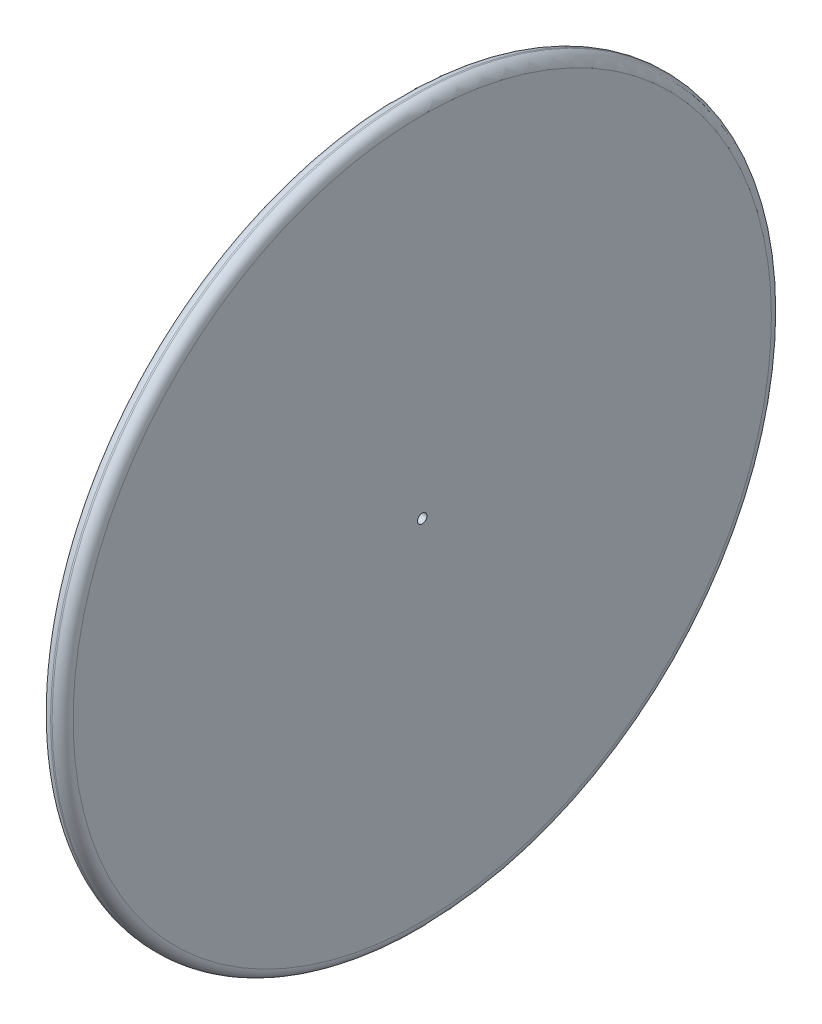
ISO-10303-21;
HEADER;
FILE_DESCRIPTION(('STEP AP214'),'2;1');
FILE_NAME('part.step','',(''),(''),'','','');
FILE_SCHEMA(('AUTOMOTIVE_DESIGN { 1 0 10303 214 1 1 1 1 }'));
ENDSEC;
DATA;
#1=APPLICATION_CONTEXT('core data for automotive mechanical design processes');
#2=APPLICATION_PROTOCOL_DEFINITION('international standard','automotive_design',2000,#1);
#3=PRODUCT_CONTEXT('',#1,'mechanical');
#4=PRODUCT('Part','Part','',(#3));
#5=PRODUCT_RELATED_PRODUCT_CATEGORY('part','',(#4));
#6=PRODUCT_DEFINITION_FORMATION('','',#4);
#7=PRODUCT_DEFINITION_CONTEXT('part definition',#1,'design');
#8=PRODUCT_DEFINITION('design','',#6,#7);
#9=PRODUCT_DEFINITION_SHAPE('','',#8);
#10=(LENGTH_UNIT() NAMED_UNIT(*) SI_UNIT(.MILLI.,.METRE.));
#11=(NAMED_UNIT(*) PLANE_ANGLE_UNIT() SI_UNIT($,.RADIAN.));
#12=(NAMED_UNIT(*) SI_UNIT($,.STERADIAN.) SOLID_ANGLE_UNIT());
#13=UNCERTAINTY_MEASURE_WITH_UNIT(LENGTH_MEASURE(1.E-05),#10,'distance_accuracy_value','');
#14=(GEOMETRIC_REPRESENTATION_CONTEXT(3) GLOBAL_UNCERTAINTY_ASSIGNED_CONTEXT((#13)) GLOBAL_UNIT_ASSIGNED_CONTEXT((#10,
#11,#12)) REPRESENTATION_CONTEXT('',''));
#15=CARTESIAN_POINT('',(0.,0.,0.));
#16=DIRECTION('',(0.,0.,1.));
#17=DIRECTION('',(1.,0.,0.));
#18=AXIS2_PLACEMENT_3D('',#15,#16,#17);
#19=CARTESIAN_POINT('',(19.05,0.,0.));
#20=DIRECTION('',(1.,0.,0.));
#21=DIRECTION('',(0.,0.,-1.));
#22=AXIS2_PLACEMENT_3D('',#19,#20,#21);
#23=PLANE('',#22);
#24=CARTESIAN_POINT('',(19.05,0.,0.));
#25=DIRECTION('',(1.,0.,0.));
#26=DIRECTION('',(0.,0.,-1.));
#27=AXIS2_PLACEMENT_3D('',#24,#25,#26);
#28=CIRCLE('',#27,295.91);
#29=CARTESIAN_POINT('',(19.05,0.,-295.91));
#30=VERTEX_POINT('',#29);
#31=EDGE_CURVE('E10',#30,#30,#28,.T.);
#32=ORIENTED_EDGE('',*,*,#31,.T.);
#33=EDGE_LOOP('',(#32));
#34=FACE_BOUND('',#33,.T.);
#35=CARTESIAN_POINT('',(19.05,0.,0.));
#36=DIRECTION('',(1.,0.,0.));
#37=DIRECTION('',(0.,0.,-1.));
#38=AXIS2_PLACEMENT_3D('',#35,#36,#37);
#39=CIRCLE('',#38,3.9878);
#40=CARTESIAN_POINT('',(19.05,0.,3.9878));
#41=VERTEX_POINT('',#40);
#42=EDGE_CURVE('E52',#41,#41,#39,.T.);
#43=ORIENTED_EDGE('',*,*,#42,.F.);
#44=EDGE_LOOP('',(#43));
#45=FACE_BOUND('',#44,.T.);
#46=ADVANCED_FACE('F32',(#34,#45),#23,.T.);
#47=CARTESIAN_POINT('',(0.,0.,0.));
#48=DIRECTION('',(1.,0.,0.));
#49=DIRECTION('',(0.,0.,-1.));
#50=AXIS2_PLACEMENT_3D('',#47,#48,#49);
#51=PLANE('',#50);
#52=CARTESIAN_POINT('',(0.,0.,0.));
#53=DIRECTION('',(1.,0.,0.));
#54=DIRECTION('',(0.,0.,-1.));
#55=AXIS2_PLACEMENT_3D('',#52,#53,#54);
#56=CIRCLE('',#55,295.91);
#57=CARTESIAN_POINT('',(0.,0.,-295.91));
#58=VERTEX_POINT('',#57);
#59=EDGE_CURVE('E39',#58,#58,#56,.F.);
#60=ORIENTED_EDGE('',*,*,#59,.T.);
#61=EDGE_LOOP('',(#60));
#62=FACE_BOUND('',#61,.T.);
#63=CARTESIAN_POINT('',(0.,0.,0.));
#64=DIRECTION('',(1.,0.,0.));
#65=DIRECTION('',(0.,0.,-1.));
#66=AXIS2_PLACEMENT_3D('',#63,#64,#65);
#67=CIRCLE('',#66,3.9878);
#68=CARTESIAN_POINT('',(0.,0.,3.9878));
#69=VERTEX_POINT('',#68);
#70=EDGE_CURVE('E53',#69,#69,#67,.T.);
#71=ORIENTED_EDGE('',*,*,#70,.T.);
#72=EDGE_LOOP('',(#71));
#73=FACE_BOUND('',#72,.T.);
#74=ADVANCED_FACE('F63',(#62,#73),#51,.F.);
#75=CARTESIAN_POINT('',(19.05,0.,0.));
#76=DIRECTION('',(-1.,0.,0.));
#77=DIRECTION('',(0.,0.,1.));
#78=AXIS2_PLACEMENT_3D('',#75,#76,#77);
#79=CYLINDRICAL_SURFACE('',#78,304.8);
#80=CARTESIAN_POINT('',(8.89,0.,0.));
#81=DIRECTION('',(1.,0.,0.));
#82=DIRECTION('',(0.,0.,-1.));
#83=AXIS2_PLACEMENT_3D('',#80,#81,#82);
#84=CIRCLE('',#83,304.8);
#85=CARTESIAN_POINT('',(8.89,0.,304.8));
#86=VERTEX_POINT('',#85);
#87=EDGE_CURVE('E43',#86,#86,#84,.T.);
#88=CARTESIAN_POINT('',(10.16,0.,0.));
#89=DIRECTION('',(1.,0.,0.));
#90=DIRECTION('',(0.,0.,-1.));
#91=AXIS2_PLACEMENT_3D('',#88,#89,#90);
#92=CIRCLE('',#91,304.8);
#93=CARTESIAN_POINT('',(10.16,0.,304.8));
#94=VERTEX_POINT('',#93);
#95=EDGE_CURVE('E47',#94,#94,#92,.F.);
#96=CARTESIAN_POINT('',(8.89,0.,304.8));
#97=CARTESIAN_POINT('',(8.90322916666666,0.,304.8));
#98=CARTESIAN_POINT('',(8.91645833333333,0.,304.8));
#99=CARTESIAN_POINT('',(8.94291666666666,0.,304.8));
#100=CARTESIAN_POINT('',(8.95614583333333,0.,304.8));
#101=CARTESIAN_POINT('',(8.98260416666666,0.,304.8));
#102=CARTESIAN_POINT('',(8.99583333333333,0.,304.8));
#103=CARTESIAN_POINT('',(9.02229166666666,0.,304.8));
#104=CARTESIAN_POINT('',(9.03552083333333,0.,304.8));
#105=CARTESIAN_POINT('',(9.06197916666666,0.,304.8));
#106=CARTESIAN_POINT('',(9.07520833333333,0.,304.8));
#107=CARTESIAN_POINT('',(9.10166666666666,0.,304.8));
#108=CARTESIAN_POINT('',(9.11489583333333,0.,304.8));
#109=CARTESIAN_POINT('',(9.14135416666666,0.,304.8));
#110=CARTESIAN_POINT('',(9.15458333333333,0.,304.8));
#111=CARTESIAN_POINT('',(9.18104166666666,0.,304.8));
#112=CARTESIAN_POINT('',(9.19427083333333,0.,304.8));
#113=CARTESIAN_POINT('',(9.22072916666666,0.,304.8));
#114=CARTESIAN_POINT('',(9.23395833333333,0.,304.8));
#115=CARTESIAN_POINT('',(9.26041666666666,0.,304.8));
#116=CARTESIAN_POINT('',(9.27364583333333,0.,304.8));
#117=CARTESIAN_POINT('',(9.30010416666667,0.,304.8));
#118=CARTESIAN_POINT('',(9.31333333333333,0.,304.8));
#119=CARTESIAN_POINT('',(9.33979166666666,0.,304.8));
#120=CARTESIAN_POINT('',(9.35302083333333,0.,304.8));
#121=CARTESIAN_POINT('',(9.37947916666666,0.,304.8));
#122=CARTESIAN_POINT('',(9.39270833333333,0.,304.8));
#123=CARTESIAN_POINT('',(9.41916666666666,0.,304.8));
#124=CARTESIAN_POINT('',(9.43239583333333,0.,304.8));
#125=CARTESIAN_POINT('',(9.45885416666667,0.,304.8));
#126=CARTESIAN_POINT('',(9.47208333333333,0.,304.8));
#127=CARTESIAN_POINT('',(9.49854166666667,0.,304.8));
#128=CARTESIAN_POINT('',(9.51177083333333,0.,304.8));
#129=CARTESIAN_POINT('',(9.53822916666667,0.,304.8));
#130=CARTESIAN_POINT('',(9.55145833333333,0.,304.8));
#131=CARTESIAN_POINT('',(9.57791666666667,0.,304.8));
#132=CARTESIAN_POINT('',(9.59114583333333,0.,304.8));
#133=CARTESIAN_POINT('',(9.61760416666666,0.,304.8));
#134=CARTESIAN_POINT('',(9.63083333333333,0.,304.8));
#135=CARTESIAN_POINT('',(9.65729166666667,0.,304.8));
#136=CARTESIAN_POINT('',(9.67052083333333,0.,304.8));
#137=CARTESIAN_POINT('',(9.69697916666667,0.,304.8));
#138=CARTESIAN_POINT('',(9.71020833333333,0.,304.8));
#139=CARTESIAN_POINT('',(9.73666666666667,0.,304.8));
#140=CARTESIAN_POINT('',(9.74989583333333,0.,304.8));
#141=CARTESIAN_POINT('',(9.77635416666667,0.,304.8));
#142=CARTESIAN_POINT('',(9.78958333333333,0.,304.8));
#143=CARTESIAN_POINT('',(9.81604166666667,0.,304.8));
#144=CARTESIAN_POINT('',(9.82927083333333,0.,304.8));
#145=CARTESIAN_POINT('',(9.85572916666666,0.,304.8));
#146=CARTESIAN_POINT('',(9.86895833333333,0.,304.8));
#147=CARTESIAN_POINT('',(9.89541666666667,0.,304.8));
#148=CARTESIAN_POINT('',(9.90864583333333,0.,304.8));
#149=CARTESIAN_POINT('',(9.93510416666667,0.,304.8));
#150=CARTESIAN_POINT('',(9.94833333333333,0.,304.8));
#151=CARTESIAN_POINT('',(9.97479166666667,0.,304.8));
#152=CARTESIAN_POINT('',(9.98802083333333,0.,304.8));
#153=CARTESIAN_POINT('',(10.0144791666667,0.,304.8));
#154=CARTESIAN_POINT('',(10.0277083333333,0.,304.8));
#155=CARTESIAN_POINT('',(10.0541666666667,0.,304.8));
#156=CARTESIAN_POINT('',(10.0673958333333,0.,304.8));
#157=CARTESIAN_POINT('',(10.0938541666667,0.,304.8));
#158=CARTESIAN_POINT('',(10.1070833333333,0.,304.8));
#159=CARTESIAN_POINT('',(10.1335416666667,0.,304.8));
#160=CARTESIAN_POINT('',(10.1467708333333,0.,304.8));
#161=CARTESIAN_POINT('',(10.16,0.,304.8));
#162=B_SPLINE_CURVE_WITH_KNOTS('',3,(#96,#97,#98,#99,#100,#101,#102,#103,#104,#105,#106,#107,
#108,#109,#110,#111,#112,#113,#114,#115,#116,#117,#118,#119,#120,#121,#122,#123,#124,#125,#126,
#127,#128,#129,#130,#131,#132,#133,#134,#135,#136,#137,#138,#139,#140,#141,#142,#143,#144,#145,
#146,#147,#148,#149,#150,#151,#152,#153,#154,#155,#156,#157,#158,#159,#160,#161),.UNSPECIFIED.,
.F.,.F.,(4,2,2,2,2,2,2,2,2,2,2,2,2,2,2,2,2,2,2,2,2,2,2,2,2,2,2,2,2,2,2,2,4),(0.,
0.0396874999999998,0.0793749999999996,0.119062500000001,0.158750000000001,0.198437500000001,
0.238125,0.2778125,0.317500000000002,0.357187500000002,0.396875000000001,0.436562500000001,
0.476250000000001,0.515937500000001,0.555625000000002,0.595312500000002,0.635000000000002,
0.674687500000002,0.714375000000001,0.754062500000003,0.793750000000003,0.833437500000003,
0.873125000000002,0.912812500000002,0.952500000000002,0.992187500000003,1.031875,1.0715625,
1.11125,1.1509375,1.190625,1.2303125,1.27),.UNSPECIFIED.);
#163=EDGE_CURVE('BSEAM68',#86,#94,#162,.T.);
#164=ORIENTED_EDGE('',*,*,#87,.T.);
#165=ORIENTED_EDGE('',*,*,#95,.T.);
#166=ORIENTED_EDGE('',*,*,#163,.T.);
#167=ORIENTED_EDGE('',*,*,#163,.F.);
#168=EDGE_LOOP('',(#164,#166,#165,#167));
#169=FACE_BOUND('',#168,.T.);
#170=ADVANCED_FACE('F68',(#169),#79,.T.);
#171=CARTESIAN_POINT('',(19.05,0.,0.));
#172=DIRECTION('',(-1.,0.,0.));
#173=DIRECTION('',(0.,0.,1.));
#174=AXIS2_PLACEMENT_3D('',#171,#172,#173);
#175=CYLINDRICAL_SURFACE('',#174,3.9878);
#176=CARTESIAN_POINT('',(19.05,0.,3.9878));
#177=CARTESIAN_POINT('',(18.8515625,0.,3.9878));
#178=CARTESIAN_POINT('',(18.653125,0.,3.9878));
#179=CARTESIAN_POINT('',(18.25625,0.,3.9878));
#180=CARTESIAN_POINT('',(18.0578125,0.,3.9878));
#181=CARTESIAN_POINT('',(17.6609375,0.,3.9878));
#182=CARTESIAN_POINT('',(17.4625,0.,3.9878));
#183=CARTESIAN_POINT('',(17.065625,0.,3.9878));
#184=CARTESIAN_POINT('',(16.8671875,0.,3.9878));
#185=CARTESIAN_POINT('',(16.4703125,0.,3.9878));
#186=CARTESIAN_POINT('',(16.271875,0.,3.9878));
#187=CARTESIAN_POINT('',(15.875,0.,3.9878));
#188=CARTESIAN_POINT('',(15.6765625,0.,3.9878));
#189=CARTESIAN_POINT('',(15.2796875,0.,3.9878));
#190=CARTESIAN_POINT('',(15.08125,0.,3.9878));
#191=CARTESIAN_POINT('',(14.684375,0.,3.9878));
#192=CARTESIAN_POINT('',(14.4859375,0.,3.9878));
#193=CARTESIAN_POINT('',(14.0890625,0.,3.9878));
#194=CARTESIAN_POINT('',(13.890625,0.,3.9878));
#195=CARTESIAN_POINT('',(13.49375,0.,3.9878));
#196=CARTESIAN_POINT('',(13.2953125,0.,3.9878));
#197=CARTESIAN_POINT('',(12.8984375,0.,3.9878));
#198=CARTESIAN_POINT('',(12.7,0.,3.9878));
#199=CARTESIAN_POINT('',(12.303125,0.,3.9878));
#200=CARTESIAN_POINT('',(12.1046875,0.,3.9878));
#201=CARTESIAN_POINT('',(11.7078125,0.,3.9878));
#202=CARTESIAN_POINT('',(11.509375,0.,3.9878));
#203=CARTESIAN_POINT('',(11.1125,0.,3.9878));
#204=CARTESIAN_POINT('',(10.9140625,0.,3.9878));
#205=CARTESIAN_POINT('',(10.5171875,0.,3.9878));
#206=CARTESIAN_POINT('',(10.31875,0.,3.9878));
#207=CARTESIAN_POINT('',(9.921875,0.,3.9878));
#208=CARTESIAN_POINT('',(9.7234375,0.,3.9878));
#209=CARTESIAN_POINT('',(9.3265625,0.,3.9878));
#210=CARTESIAN_POINT('',(9.128125,0.,3.9878));
#211=CARTESIAN_POINT('',(8.73125,0.,3.9878));
#212=CARTESIAN_POINT('',(8.5328125,0.,3.9878));
#213=CARTESIAN_POINT('',(8.1359375,0.,3.9878));
#214=CARTESIAN_POINT('',(7.9375,0.,3.9878));
#215=CARTESIAN_POINT('',(7.540625,0.,3.9878));
#216=CARTESIAN_POINT('',(7.3421875,0.,3.9878));
#217=CARTESIAN_POINT('',(6.9453125,0.,3.9878));
#218=CARTESIAN_POINT('',(6.746875,0.,3.9878));
#219=CARTESIAN_POINT('',(6.35,0.,3.9878));
#220=CARTESIAN_POINT('',(6.1515625,0.,3.9878));
#221=CARTESIAN_POINT('',(5.7546875,0.,3.9878));
#222=CARTESIAN_POINT('',(5.55625,0.,3.9878));
#223=CARTESIAN_POINT('',(5.159375,0.,3.9878));
#224=CARTESIAN_POINT('',(4.9609375,0.,3.9878));
#225=CARTESIAN_POINT('',(4.5640625,0.,3.9878));
#226=CARTESIAN_POINT('',(4.365625,0.,3.9878));
#227=CARTESIAN_POINT('',(3.96875,0.,3.9878));
#228=CARTESIAN_POINT('',(3.7703125,0.,3.9878));
#229=CARTESIAN_POINT('',(3.3734375,0.,3.9878));
#230=CARTESIAN_POINT('',(3.175,0.,3.9878));
#231=CARTESIAN_POINT('',(2.778125,0.,3.9878));
#232=CARTESIAN_POINT('',(2.5796875,0.,3.9878));
#233=CARTESIAN_POINT('',(2.1828125,0.,3.9878));
#234=CARTESIAN_POINT('',(1.984375,0.,3.9878));
#235=CARTESIAN_POINT('',(1.5875,0.,3.9878));
#236=CARTESIAN_POINT('',(1.3890625,0.,3.9878));
#237=CARTESIAN_POINT('',(0.992187500000001,0.,3.9878));
#238=CARTESIAN_POINT('',(0.793750000000001,0.,3.9878));
#239=CARTESIAN_POINT('',(0.396875,0.,3.9878));
#240=CARTESIAN_POINT('',(0.1984375,0.,3.9878));
#241=CARTESIAN_POINT('',(0.,0.,3.9878));
#242=B_SPLINE_CURVE_WITH_KNOTS('',3,(#176,#177,#178,#179,#180,#181,#182,#183,#184,#185,#186,
#187,#188,#189,#190,#191,#192,#193,#194,#195,#196,#197,#198,#199,#200,#201,#202,#203,#204,#205,
#206,#207,#208,#209,#210,#211,#212,#213,#214,#215,#216,#217,#218,#219,#220,#221,#222,#223,#224,
#225,#226,#227,#228,#229,#230,#231,#232,#233,#234,#235,#236,#237,#238,#239,#240,#241),
.UNSPECIFIED.,.F.,.F.,(4,2,2,2,2,2,2,2,2,2,2,2,2,2,2,2,2,2,2,2,2,2,2,2,2,2,2,2,2,2,2,2,4),(0.,
0.5953125,1.190625,1.7859375,2.38125,2.9765625,3.571875,4.1671875,4.7625,5.3578125,5.953125,
6.5484375,7.14375,7.7390625,8.334375,8.9296875,9.525,10.1203125,10.715625,11.3109375,11.90625,
12.5015625,13.096875,13.6921875,14.2875,14.8828125,15.478125,16.0734375,16.66875,17.2640625,
17.859375,18.4546875,19.05),.UNSPECIFIED.);
#243=EDGE_CURVE('BSEAM59',#41,#69,#242,.T.);
#244=ORIENTED_EDGE('',*,*,#42,.T.);
#245=ORIENTED_EDGE('',*,*,#70,.F.);
#246=ORIENTED_EDGE('',*,*,#243,.T.);
#247=ORIENTED_EDGE('',*,*,#243,.F.);
#248=EDGE_LOOP('',(#244,#246,#245,#247));
#249=FACE_BOUND('',#248,.T.);
#250=ADVANCED_FACE('F59',(#249),#175,.F.);
#251=CARTESIAN_POINT('',(8.89,0.,0.));
#252=DIRECTION('',(1.,0.,0.));
#253=DIRECTION('',(0.,0.,-1.));
#254=AXIS2_PLACEMENT_3D('',#251,#252,#253);
#255=TOROIDAL_SURFACE('',#254,295.91,8.89);
#256=ORIENTED_EDGE('',*,*,#59,.F.);
#257=EDGE_LOOP('',(#256));
#258=FACE_BOUND('',#257,.T.);
#259=ORIENTED_EDGE('',*,*,#87,.F.);
#260=EDGE_LOOP('',(#259));
#261=FACE_BOUND('',#260,.T.);
#262=ADVANCED_FACE('F74',(#258,#261),#255,.T.);
#263=CARTESIAN_POINT('',(10.16,0.,0.));
#264=DIRECTION('',(1.,0.,0.));
#265=DIRECTION('',(0.,0.,-1.));
#266=AXIS2_PLACEMENT_3D('',#263,#264,#265);
#267=TOROIDAL_SURFACE('',#266,295.91,8.89);
#268=ORIENTED_EDGE('',*,*,#95,.F.);
#269=EDGE_LOOP('',(#268));
#270=FACE_BOUND('',#269,.T.);
#271=ORIENTED_EDGE('',*,*,#31,.F.);
#272=EDGE_LOOP('',(#271));
#273=FACE_BOUND('',#272,.T.);
#274=ADVANCED_FACE('F34',(#270,#273),#267,.T.);
#275=CLOSED_SHELL('',(#46,#74,#170,#250,#262,#274));
#276=MANIFOLD_SOLID_BREP('B2',#275);
#277=ADVANCED_BREP_SHAPE_REPRESENTATION('',(#18,#276),#14);
#278=SHAPE_DEFINITION_REPRESENTATION(#9,#277);
ENDSEC;
END-ISO-10303-21;
